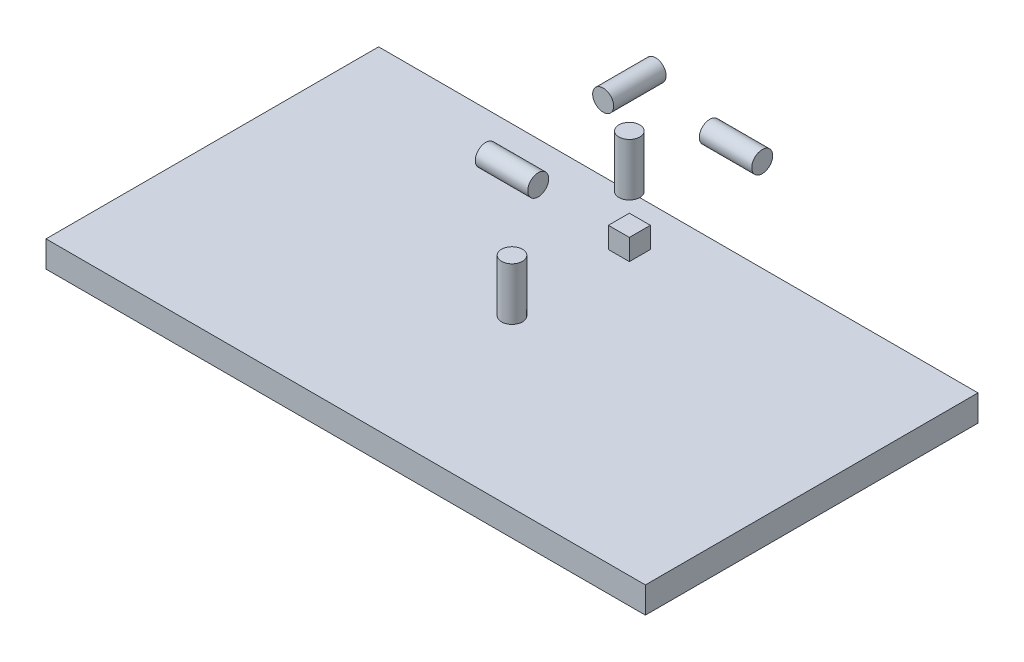
ISO-10303-21;
HEADER;
FILE_DESCRIPTION(('STEP AP214'),'2;1');
FILE_NAME('part.step','',(''),(''),'','','');
FILE_SCHEMA(('AUTOMOTIVE_DESIGN { 1 0 10303 214 1 1 1 1 }'));
ENDSEC;
DATA;
#1=APPLICATION_CONTEXT('core data for automotive mechanical design processes');
#2=APPLICATION_PROTOCOL_DEFINITION('international standard','automotive_design',2000,#1);
#3=PRODUCT_CONTEXT('',#1,'mechanical');
#4=PRODUCT('Part','Part','',(#3));
#5=PRODUCT_RELATED_PRODUCT_CATEGORY('part','',(#4));
#6=PRODUCT_DEFINITION_FORMATION('','',#4);
#7=PRODUCT_DEFINITION_CONTEXT('part definition',#1,'design');
#8=PRODUCT_DEFINITION('design','',#6,#7);
#9=PRODUCT_DEFINITION_SHAPE('','',#8);
#10=(LENGTH_UNIT() NAMED_UNIT(*) SI_UNIT(.MILLI.,.METRE.));
#11=(NAMED_UNIT(*) PLANE_ANGLE_UNIT() SI_UNIT($,.RADIAN.));
#12=(NAMED_UNIT(*) SI_UNIT($,.STERADIAN.) SOLID_ANGLE_UNIT());
#13=UNCERTAINTY_MEASURE_WITH_UNIT(LENGTH_MEASURE(1.E-05),#10,'distance_accuracy_value','');
#14=(GEOMETRIC_REPRESENTATION_CONTEXT(3) GLOBAL_UNCERTAINTY_ASSIGNED_CONTEXT((#13)) GLOBAL_UNIT_ASSIGNED_CONTEXT((#10,
#11,#12)) REPRESENTATION_CONTEXT('',''));
#15=CARTESIAN_POINT('',(0.,0.,0.));
#16=DIRECTION('',(0.,0.,1.));
#17=DIRECTION('',(1.,0.,0.));
#18=AXIS2_PLACEMENT_3D('',#15,#16,#17);
#19=CARTESIAN_POINT('',(95.3969810050899,98.6121241485876,0.));
#20=DIRECTION('',(-1.,0.,0.));
#21=DIRECTION('',(0.,0.,1.));
#22=AXIS2_PLACEMENT_3D('',#19,#20,#21);
#23=CYLINDRICAL_SURFACE('',#22,4.);
#24=CARTESIAN_POINT('',(95.3969810050899,98.6121241485876,0.));
#25=DIRECTION('',(1.,0.,0.));
#26=DIRECTION('',(0.,0.,-1.));
#27=AXIS2_PLACEMENT_3D('',#24,#25,#26);
#28=CIRCLE('',#27,4.);
#29=CARTESIAN_POINT('',(95.3969810050899,98.6121241485876,-4.));
#30=VERTEX_POINT('',#29);
#31=EDGE_CURVE('E11',#30,#30,#28,.T.);
#32=ORIENTED_EDGE('',*,*,#31,.F.);
#33=EDGE_LOOP('',(#32));
#34=FACE_BOUND('',#33,.T.);
#35=CARTESIAN_POINT('',(75.3969810050899,98.6121241485876,0.));
#36=DIRECTION('',(1.,0.,0.));
#37=DIRECTION('',(0.,0.,-1.));
#38=AXIS2_PLACEMENT_3D('',#35,#36,#37);
#39=CIRCLE('',#38,4.);
#40=CARTESIAN_POINT('',(75.3969810050899,98.6121241485876,-4.));
#41=VERTEX_POINT('',#40);
#42=EDGE_CURVE('E42',#41,#41,#39,.T.);
#43=ORIENTED_EDGE('',*,*,#42,.T.);
#44=EDGE_LOOP('',(#43));
#45=FACE_BOUND('',#44,.T.);
#46=ADVANCED_FACE('F39',(#34,#45),#23,.T.);
#47=CARTESIAN_POINT('',(95.3969810050899,98.6121241485876,0.));
#48=DIRECTION('',(1.,0.,0.));
#49=DIRECTION('',(0.,0.,-1.));
#50=AXIS2_PLACEMENT_3D('',#47,#48,#49);
#51=PLANE('',#50);
#52=ORIENTED_EDGE('',*,*,#31,.T.);
#53=EDGE_LOOP('',(#52));
#54=FACE_BOUND('',#53,.T.);
#55=ADVANCED_FACE('F54',(#54),#51,.T.);
#56=CARTESIAN_POINT('',(75.3969810050899,98.6121241485876,0.));
#57=DIRECTION('',(1.,0.,0.));
#58=DIRECTION('',(0.,0.,-1.));
#59=AXIS2_PLACEMENT_3D('',#56,#57,#58);
#60=PLANE('',#59);
#61=ORIENTED_EDGE('',*,*,#42,.F.);
#62=EDGE_LOOP('',(#61));
#63=FACE_BOUND('',#62,.T.);
#64=ADVANCED_FACE('F52',(#63),#60,.F.);
#65=CLOSED_SHELL('',(#46,#55,#64));
#66=MANIFOLD_SOLID_BREP('B2',#65);
#67=CARTESIAN_POINT('',(44.7451399134025,98.6121241485876,10.));
#68=DIRECTION('',(0.,0.,-1.));
#69=DIRECTION('',(-1.,0.,0.));
#70=AXIS2_PLACEMENT_3D('',#67,#68,#69);
#71=CYLINDRICAL_SURFACE('',#70,4.00000000000001);
#72=CARTESIAN_POINT('',(44.7451399134025,98.6121241485876,10.));
#73=DIRECTION('',(0.,0.,1.));
#74=DIRECTION('',(1.,0.,0.));
#75=AXIS2_PLACEMENT_3D('',#72,#73,#74);
#76=CIRCLE('',#75,4.00000000000001);
#77=CARTESIAN_POINT('',(48.7451399134025,98.6121241485876,10.));
#78=VERTEX_POINT('',#77);
#79=EDGE_CURVE('E38',#78,#78,#76,.T.);
#80=ORIENTED_EDGE('',*,*,#79,.F.);
#81=EDGE_LOOP('',(#80));
#82=FACE_BOUND('',#81,.T.);
#83=CARTESIAN_POINT('',(44.7451399134025,98.6121241485876,-10.));
#84=DIRECTION('',(0.,0.,1.));
#85=DIRECTION('',(1.,0.,0.));
#86=AXIS2_PLACEMENT_3D('',#83,#84,#85);
#87=CIRCLE('',#86,4.00000000000001);
#88=CARTESIAN_POINT('',(48.7451399134025,98.6121241485876,-10.));
#89=VERTEX_POINT('',#88);
#90=EDGE_CURVE('E90',#89,#89,#87,.T.);
#91=ORIENTED_EDGE('',*,*,#90,.T.);
#92=EDGE_LOOP('',(#91));
#93=FACE_BOUND('',#92,.T.);
#94=ADVANCED_FACE('F87',(#82,#93),#71,.T.);
#95=CARTESIAN_POINT('',(44.7451399134025,98.6121241485876,10.));
#96=DIRECTION('',(0.,0.,1.));
#97=DIRECTION('',(1.,0.,0.));
#98=AXIS2_PLACEMENT_3D('',#95,#96,#97);
#99=PLANE('',#98);
#100=ORIENTED_EDGE('',*,*,#79,.T.);
#101=EDGE_LOOP('',(#100));
#102=FACE_BOUND('',#101,.T.);
#103=ADVANCED_FACE('F102',(#102),#99,.T.);
#104=CARTESIAN_POINT('',(44.7451399134025,98.6121241485876,-10.));
#105=DIRECTION('',(0.,0.,1.));
#106=DIRECTION('',(1.,0.,0.));
#107=AXIS2_PLACEMENT_3D('',#104,#105,#106);
#108=PLANE('',#107);
#109=ORIENTED_EDGE('',*,*,#90,.F.);
#110=EDGE_LOOP('',(#109));
#111=FACE_BOUND('',#110,.T.);
#112=ADVANCED_FACE('F100',(#111),#108,.F.);
#113=CLOSED_SHELL('',(#94,#103,#112));
#114=MANIFOLD_SOLID_BREP('B6',#113);
#115=CARTESIAN_POINT('',(44.7451399134025,83.443144658152,0.));
#116=DIRECTION('',(0.,-1.,0.));
#117=DIRECTION('',(0.,0.,-1.));
#118=AXIS2_PLACEMENT_3D('',#115,#116,#117);
#119=CYLINDRICAL_SURFACE('',#118,4.00000000000001);
#120=CARTESIAN_POINT('',(44.7451399134025,83.443144658152,0.));
#121=DIRECTION('',(0.,1.,0.));
#122=DIRECTION('',(0.,0.,1.));
#123=AXIS2_PLACEMENT_3D('',#120,#121,#122);
#124=CIRCLE('',#123,4.00000000000001);
#125=CARTESIAN_POINT('',(44.7451399134025,83.443144658152,4.00000000000001));
#126=VERTEX_POINT('',#125);
#127=EDGE_CURVE('E86',#126,#126,#124,.T.);
#128=ORIENTED_EDGE('',*,*,#127,.F.);
#129=EDGE_LOOP('',(#128));
#130=FACE_BOUND('',#129,.T.);
#131=CARTESIAN_POINT('',(44.7451399134025,63.4431446581519,0.));
#132=DIRECTION('',(0.,1.,0.));
#133=DIRECTION('',(0.,0.,1.));
#134=AXIS2_PLACEMENT_3D('',#131,#132,#133);
#135=CIRCLE('',#134,4.00000000000001);
#136=CARTESIAN_POINT('',(44.7451399134025,63.4431446581519,4.00000000000001));
#137=VERTEX_POINT('',#136);
#138=EDGE_CURVE('E140',#137,#137,#135,.T.);
#139=ORIENTED_EDGE('',*,*,#138,.T.);
#140=EDGE_LOOP('',(#139));
#141=FACE_BOUND('',#140,.T.);
#142=ADVANCED_FACE('F137',(#130,#141),#119,.T.);
#143=CARTESIAN_POINT('',(44.7451399134025,83.443144658152,0.));
#144=DIRECTION('',(0.,1.,0.));
#145=DIRECTION('',(0.,0.,1.));
#146=AXIS2_PLACEMENT_3D('',#143,#144,#145);
#147=PLANE('',#146);
#148=ORIENTED_EDGE('',*,*,#127,.T.);
#149=EDGE_LOOP('',(#148));
#150=FACE_BOUND('',#149,.T.);
#151=ADVANCED_FACE('F152',(#150),#147,.T.);
#152=CARTESIAN_POINT('',(44.7451399134025,63.4431446581519,0.));
#153=DIRECTION('',(0.,1.,0.));
#154=DIRECTION('',(0.,0.,1.));
#155=AXIS2_PLACEMENT_3D('',#152,#153,#154);
#156=PLANE('',#155);
#157=ORIENTED_EDGE('',*,*,#138,.F.);
#158=EDGE_LOOP('',(#157));
#159=FACE_BOUND('',#158,.T.);
#160=ADVANCED_FACE('F150',(#159),#156,.F.);
#161=CLOSED_SHELL('',(#142,#151,#160));
#162=MANIFOLD_SOLID_BREP('B33',#161);
#163=CARTESIAN_POINT('',(48.7451399134025,44.2741651677163,4.));
#164=DIRECTION('',(0.,0.,-1.));
#165=DIRECTION('',(-1.,0.,0.));
#166=AXIS2_PLACEMENT_3D('',#163,#164,#165);
#167=PLANE('',#166);
#168=DIRECTION('',(0.,-1.,0.));
#169=VECTOR('',#168,1.);
#170=CARTESIAN_POINT('',(40.7451399134025,44.2741651677163,4.));
#171=LINE('',#170,#169);
#172=CARTESIAN_POINT('',(40.7451399134025,52.2741651677163,4.));
#173=VERTEX_POINT('',#172);
#174=CARTESIAN_POINT('',(40.7451399134025,44.2741651677163,4.));
#175=VERTEX_POINT('',#174);
#176=EDGE_CURVE('E248',#173,#175,#171,.T.);
#177=ORIENTED_EDGE('',*,*,#176,.T.);
#178=DIRECTION('',(-1.,0.,0.));
#179=VECTOR('',#178,1.);
#180=CARTESIAN_POINT('',(48.7451399134025,44.2741651677163,4.));
#181=LINE('',#180,#179);
#182=CARTESIAN_POINT('',(48.7451399134025,44.2741651677163,4.));
#183=VERTEX_POINT('',#182);
#184=EDGE_CURVE('E135',#183,#175,#181,.T.);
#185=ORIENTED_EDGE('',*,*,#184,.F.);
#186=DIRECTION('',(0.,-1.,0.));
#187=VECTOR('',#186,1.);
#188=CARTESIAN_POINT('',(48.7451399134025,44.2741651677163,4.));
#189=LINE('',#188,#187);
#190=CARTESIAN_POINT('',(48.7451399134025,52.2741651677163,4.));
#191=VERTEX_POINT('',#190);
#192=EDGE_CURVE('E236',#191,#183,#189,.T.);
#193=ORIENTED_EDGE('',*,*,#192,.F.);
#194=DIRECTION('',(-1.,0.,0.));
#195=VECTOR('',#194,1.);
#196=CARTESIAN_POINT('',(48.7451399134025,52.2741651677163,4.));
#197=LINE('',#196,#195);
#198=EDGE_CURVE('E244',#191,#173,#197,.T.);
#199=ORIENTED_EDGE('',*,*,#198,.T.);
#200=EDGE_LOOP('',(#177,#185,#193,#199));
#201=FACE_BOUND('',#200,.T.);
#202=ADVANCED_FACE('F185',(#201),#167,.F.);
#203=CARTESIAN_POINT('',(48.7451399134025,44.2741651677163,-4.));
#204=DIRECTION('',(0.,1.,0.));
#205=DIRECTION('',(0.,0.,1.));
#206=AXIS2_PLACEMENT_3D('',#203,#204,#205);
#207=PLANE('',#206);
#208=DIRECTION('',(0.,0.,-1.));
#209=VECTOR('',#208,1.);
#210=CARTESIAN_POINT('',(40.7451399134025,44.2741651677163,-4.));
#211=LINE('',#210,#209);
#212=CARTESIAN_POINT('',(40.7451399134025,44.2741651677163,-4.));
#213=VERTEX_POINT('',#212);
#214=EDGE_CURVE('E240',#175,#213,#211,.T.);
#215=ORIENTED_EDGE('',*,*,#214,.T.);
#216=DIRECTION('',(-1.,0.,0.));
#217=VECTOR('',#216,1.);
#218=CARTESIAN_POINT('',(48.7451399134025,44.2741651677163,-4.));
#219=LINE('',#218,#217);
#220=CARTESIAN_POINT('',(48.7451399134025,44.2741651677163,-4.));
#221=VERTEX_POINT('',#220);
#222=EDGE_CURVE('E193',#221,#213,#219,.T.);
#223=ORIENTED_EDGE('',*,*,#222,.F.);
#224=DIRECTION('',(0.,0.,-1.));
#225=VECTOR('',#224,1.);
#226=CARTESIAN_POINT('',(48.7451399134025,44.2741651677163,-4.));
#227=LINE('',#226,#225);
#228=EDGE_CURVE('E231',#183,#221,#227,.T.);
#229=ORIENTED_EDGE('',*,*,#228,.F.);
#230=ORIENTED_EDGE('',*,*,#184,.T.);
#231=EDGE_LOOP('',(#215,#223,#229,#230));
#232=FACE_BOUND('',#231,.T.);
#233=ADVANCED_FACE('F239',(#232),#207,.F.);
#234=CARTESIAN_POINT('',(48.7451399134025,44.2741651677163,-4.));
#235=DIRECTION('',(0.,0.,1.));
#236=DIRECTION('',(1.,0.,0.));
#237=AXIS2_PLACEMENT_3D('',#234,#235,#236);
#238=PLANE('',#237);
#239=DIRECTION('',(0.,1.,0.));
#240=VECTOR('',#239,1.);
#241=CARTESIAN_POINT('',(40.7451399134025,44.2741651677163,-4.));
#242=LINE('',#241,#240);
#243=CARTESIAN_POINT('',(40.7451399134025,52.2741651677163,-4.));
#244=VERTEX_POINT('',#243);
#245=EDGE_CURVE('E218',#213,#244,#242,.T.);
#246=ORIENTED_EDGE('',*,*,#245,.T.);
#247=DIRECTION('',(-1.,0.,0.));
#248=VECTOR('',#247,1.);
#249=CARTESIAN_POINT('',(48.7451399134025,52.2741651677163,-4.));
#250=LINE('',#249,#248);
#251=CARTESIAN_POINT('',(48.7451399134025,52.2741651677163,-4.));
#252=VERTEX_POINT('',#251);
#253=EDGE_CURVE('E241',#252,#244,#250,.T.);
#254=ORIENTED_EDGE('',*,*,#253,.F.);
#255=DIRECTION('',(0.,1.,0.));
#256=VECTOR('',#255,1.);
#257=CARTESIAN_POINT('',(48.7451399134025,44.2741651677163,-4.));
#258=LINE('',#257,#256);
#259=EDGE_CURVE('E234',#221,#252,#258,.T.);
#260=ORIENTED_EDGE('',*,*,#259,.F.);
#261=ORIENTED_EDGE('',*,*,#222,.T.);
#262=EDGE_LOOP('',(#246,#254,#260,#261));
#263=FACE_BOUND('',#262,.T.);
#264=ADVANCED_FACE('F242',(#263),#238,.F.);
#265=CARTESIAN_POINT('',(48.7451399134025,52.2741651677163,-4.));
#266=DIRECTION('',(0.,-1.,0.));
#267=DIRECTION('',(0.,0.,-1.));
#268=AXIS2_PLACEMENT_3D('',#265,#266,#267);
#269=PLANE('',#268);
#270=DIRECTION('',(0.,0.,1.));
#271=VECTOR('',#270,1.);
#272=CARTESIAN_POINT('',(40.7451399134025,52.2741651677163,-4.));
#273=LINE('',#272,#271);
#274=EDGE_CURVE('E224',#244,#173,#273,.T.);
#275=ORIENTED_EDGE('',*,*,#274,.T.);
#276=ORIENTED_EDGE('',*,*,#198,.F.);
#277=DIRECTION('',(0.,0.,1.));
#278=VECTOR('',#277,1.);
#279=CARTESIAN_POINT('',(48.7451399134025,52.2741651677163,-4.));
#280=LINE('',#279,#278);
#281=EDGE_CURVE('E201',#252,#191,#280,.T.);
#282=ORIENTED_EDGE('',*,*,#281,.F.);
#283=ORIENTED_EDGE('',*,*,#253,.T.);
#284=EDGE_LOOP('',(#275,#276,#282,#283));
#285=FACE_BOUND('',#284,.T.);
#286=ADVANCED_FACE('F255',(#285),#269,.F.);
#287=CARTESIAN_POINT('',(48.7451399134025,0.,0.));
#288=DIRECTION('',(1.,0.,0.));
#289=DIRECTION('',(0.,0.,-1.));
#290=AXIS2_PLACEMENT_3D('',#287,#288,#289);
#291=PLANE('',#290);
#292=ORIENTED_EDGE('',*,*,#192,.T.);
#293=ORIENTED_EDGE('',*,*,#228,.T.);
#294=ORIENTED_EDGE('',*,*,#259,.T.);
#295=ORIENTED_EDGE('',*,*,#281,.T.);
#296=EDGE_LOOP('',(#292,#293,#294,#295));
#297=FACE_BOUND('',#296,.T.);
#298=ADVANCED_FACE('F232',(#297),#291,.T.);
#299=CARTESIAN_POINT('',(40.7451399134025,0.,0.));
#300=DIRECTION('',(1.,0.,0.));
#301=DIRECTION('',(0.,0.,-1.));
#302=AXIS2_PLACEMENT_3D('',#299,#300,#301);
#303=PLANE('',#302);
#304=ORIENTED_EDGE('',*,*,#176,.F.);
#305=ORIENTED_EDGE('',*,*,#274,.F.);
#306=ORIENTED_EDGE('',*,*,#245,.F.);
#307=ORIENTED_EDGE('',*,*,#214,.F.);
#308=EDGE_LOOP('',(#304,#305,#306,#307));
#309=FACE_BOUND('',#308,.T.);
#310=ADVANCED_FACE('F258',(#309),#303,.F.);
#311=CLOSED_SHELL('',(#202,#233,#264,#286,#298,#310));
#312=MANIFOLD_SOLID_BREP('B81',#311);
#313=CARTESIAN_POINT('',(10.,48.2741651677163,0.));
#314=DIRECTION('',(-1.,0.,0.));
#315=DIRECTION('',(0.,0.,1.));
#316=AXIS2_PLACEMENT_3D('',#313,#314,#315);
#317=CYLINDRICAL_SURFACE('',#316,4.);
#318=CARTESIAN_POINT('',(10.,48.2741651677163,0.));
#319=DIRECTION('',(1.,0.,0.));
#320=DIRECTION('',(0.,0.,-1.));
#321=AXIS2_PLACEMENT_3D('',#318,#319,#320);
#322=CIRCLE('',#321,4.);
#323=CARTESIAN_POINT('',(10.,48.2741651677163,-4.));
#324=VERTEX_POINT('',#323);
#325=EDGE_CURVE('E184',#324,#324,#322,.T.);
#326=ORIENTED_EDGE('',*,*,#325,.F.);
#327=EDGE_LOOP('',(#326));
#328=FACE_BOUND('',#327,.T.);
#329=CARTESIAN_POINT('',(-10.,48.2741651677163,0.));
#330=DIRECTION('',(1.,0.,0.));
#331=DIRECTION('',(0.,0.,-1.));
#332=AXIS2_PLACEMENT_3D('',#329,#330,#331);
#333=CIRCLE('',#332,4.);
#334=CARTESIAN_POINT('',(-10.,48.2741651677163,-4.));
#335=VERTEX_POINT('',#334);
#336=EDGE_CURVE('E320',#335,#335,#333,.T.);
#337=ORIENTED_EDGE('',*,*,#336,.T.);
#338=EDGE_LOOP('',(#337));
#339=FACE_BOUND('',#338,.T.);
#340=ADVANCED_FACE('F317',(#328,#339),#317,.T.);
#341=CARTESIAN_POINT('',(10.,48.2741651677163,0.));
#342=DIRECTION('',(1.,0.,0.));
#343=DIRECTION('',(0.,0.,-1.));
#344=AXIS2_PLACEMENT_3D('',#341,#342,#343);
#345=PLANE('',#344);
#346=ORIENTED_EDGE('',*,*,#325,.T.);
#347=EDGE_LOOP('',(#346));
#348=FACE_BOUND('',#347,.T.);
#349=ADVANCED_FACE('F332',(#348),#345,.T.);
#350=CARTESIAN_POINT('',(-10.,48.2741651677163,0.));
#351=DIRECTION('',(1.,0.,0.));
#352=DIRECTION('',(0.,0.,-1.));
#353=AXIS2_PLACEMENT_3D('',#350,#351,#352);
#354=PLANE('',#353);
#355=ORIENTED_EDGE('',*,*,#336,.F.);
#356=EDGE_LOOP('',(#355));
#357=FACE_BOUND('',#356,.T.);
#358=ADVANCED_FACE('F330',(#357),#354,.F.);
#359=CLOSED_SHELL('',(#340,#349,#358));
#360=MANIFOLD_SOLID_BREP('B129',#359);
#361=CARTESIAN_POINT('',(-114.255899932367,-10.,63.4021178815449));
#362=DIRECTION('',(-1.,0.,0.));
#363=DIRECTION('',(0.,0.,1.));
#364=AXIS2_PLACEMENT_3D('',#361,#362,#363);
#365=PLANE('',#364);
#366=DIRECTION('',(0.,0.,1.));
#367=VECTOR('',#366,1.);
#368=CARTESIAN_POINT('',(-114.255899932367,0.,63.4021178815449));
#369=LINE('',#368,#367);
#370=CARTESIAN_POINT('',(-114.255899932367,0.,-63.4021178815449));
#371=VERTEX_POINT('',#370);
#372=CARTESIAN_POINT('',(-114.255899932367,0.,63.4021178815449));
#373=VERTEX_POINT('',#372);
#374=EDGE_CURVE('E422',#371,#373,#369,.T.);
#375=ORIENTED_EDGE('',*,*,#374,.F.);
#376=DIRECTION('',(0.,1.,0.));
#377=VECTOR('',#376,1.);
#378=CARTESIAN_POINT('',(-114.255899932367,-10.,-63.4021178815449));
#379=LINE('',#378,#377);
#380=CARTESIAN_POINT('',(-114.255899932367,-10.,-63.4021178815449));
#381=VERTEX_POINT('',#380);
#382=EDGE_CURVE('E315',#381,#371,#379,.T.);
#383=ORIENTED_EDGE('',*,*,#382,.F.);
#384=DIRECTION('',(0.,0.,1.));
#385=VECTOR('',#384,1.);
#386=CARTESIAN_POINT('',(-114.255899932367,-10.,63.4021178815449));
#387=LINE('',#386,#385);
#388=CARTESIAN_POINT('',(-114.255899932367,-10.,63.4021178815449));
#389=VERTEX_POINT('',#388);
#390=EDGE_CURVE('E415',#381,#389,#387,.T.);
#391=ORIENTED_EDGE('',*,*,#390,.T.);
#392=DIRECTION('',(0.,1.,0.));
#393=VECTOR('',#392,1.);
#394=CARTESIAN_POINT('',(-114.255899932367,-10.,63.4021178815449));
#395=LINE('',#394,#393);
#396=EDGE_CURVE('E360',#389,#373,#395,.T.);
#397=ORIENTED_EDGE('',*,*,#396,.T.);
#398=EDGE_LOOP('',(#375,#383,#391,#397));
#399=FACE_BOUND('',#398,.T.);
#400=ADVANCED_FACE('F357',(#399),#365,.T.);
#401=CARTESIAN_POINT('',(114.255899932367,-10.,-63.4021178815449));
#402=DIRECTION('',(0.,0.,-1.));
#403=DIRECTION('',(-1.,0.,0.));
#404=AXIS2_PLACEMENT_3D('',#401,#402,#403);
#405=PLANE('',#404);
#406=DIRECTION('',(-1.,0.,0.));
#407=VECTOR('',#406,1.);
#408=CARTESIAN_POINT('',(114.255899932367,0.,-63.4021178815449));
#409=LINE('',#408,#407);
#410=CARTESIAN_POINT('',(114.255899932367,0.,-63.4021178815449));
#411=VERTEX_POINT('',#410);
#412=EDGE_CURVE('E417',#411,#371,#409,.T.);
#413=ORIENTED_EDGE('',*,*,#412,.F.);
#414=DIRECTION('',(0.,1.,0.));
#415=VECTOR('',#414,1.);
#416=CARTESIAN_POINT('',(114.255899932367,-10.,-63.4021178815449));
#417=LINE('',#416,#415);
#418=CARTESIAN_POINT('',(114.255899932367,-10.,-63.4021178815449));
#419=VERTEX_POINT('',#418);
#420=EDGE_CURVE('E366',#419,#411,#417,.T.);
#421=ORIENTED_EDGE('',*,*,#420,.F.);
#422=DIRECTION('',(-1.,0.,0.));
#423=VECTOR('',#422,1.);
#424=CARTESIAN_POINT('',(114.255899932367,-10.,-63.4021178815449));
#425=LINE('',#424,#423);
#426=EDGE_CURVE('E412',#419,#381,#425,.T.);
#427=ORIENTED_EDGE('',*,*,#426,.T.);
#428=ORIENTED_EDGE('',*,*,#382,.T.);
#429=EDGE_LOOP('',(#413,#421,#427,#428));
#430=FACE_BOUND('',#429,.T.);
#431=ADVANCED_FACE('F433',(#430),#405,.T.);
#432=CARTESIAN_POINT('',(114.255899932367,-10.,63.4021178815449));
#433=DIRECTION('',(1.,0.,0.));
#434=DIRECTION('',(0.,0.,-1.));
#435=AXIS2_PLACEMENT_3D('',#432,#433,#434);
#436=PLANE('',#435);
#437=DIRECTION('',(0.,0.,-1.));
#438=VECTOR('',#437,1.);
#439=CARTESIAN_POINT('',(114.255899932367,0.,63.4021178815449));
#440=LINE('',#439,#438);
#441=CARTESIAN_POINT('',(114.255899932367,0.,63.4021178815449));
#442=VERTEX_POINT('',#441);
#443=EDGE_CURVE('E407',#442,#411,#440,.T.);
#444=ORIENTED_EDGE('',*,*,#443,.F.);
#445=DIRECTION('',(0.,1.,0.));
#446=VECTOR('',#445,1.);
#447=CARTESIAN_POINT('',(114.255899932367,-10.,63.4021178815449));
#448=LINE('',#447,#446);
#449=CARTESIAN_POINT('',(114.255899932367,-10.,63.4021178815449));
#450=VERTEX_POINT('',#449);
#451=EDGE_CURVE('E402',#450,#442,#448,.T.);
#452=ORIENTED_EDGE('',*,*,#451,.F.);
#453=DIRECTION('',(0.,0.,-1.));
#454=VECTOR('',#453,1.);
#455=CARTESIAN_POINT('',(114.255899932367,-10.,63.4021178815449));
#456=LINE('',#455,#454);
#457=EDGE_CURVE('E405',#450,#419,#456,.T.);
#458=ORIENTED_EDGE('',*,*,#457,.T.);
#459=ORIENTED_EDGE('',*,*,#420,.T.);
#460=EDGE_LOOP('',(#444,#452,#458,#459));
#461=FACE_BOUND('',#460,.T.);
#462=ADVANCED_FACE('F404',(#461),#436,.T.);
#463=CARTESIAN_POINT('',(114.255899932367,-10.,63.4021178815449));
#464=DIRECTION('',(0.,0.,1.));
#465=DIRECTION('',(1.,0.,0.));
#466=AXIS2_PLACEMENT_3D('',#463,#464,#465);
#467=PLANE('',#466);
#468=DIRECTION('',(1.,0.,0.));
#469=VECTOR('',#468,1.);
#470=CARTESIAN_POINT('',(114.255899932367,0.,63.4021178815449));
#471=LINE('',#470,#469);
#472=EDGE_CURVE('E425',#373,#442,#471,.T.);
#473=ORIENTED_EDGE('',*,*,#472,.F.);
#474=ORIENTED_EDGE('',*,*,#396,.F.);
#475=DIRECTION('',(1.,0.,0.));
#476=VECTOR('',#475,1.);
#477=CARTESIAN_POINT('',(114.255899932367,-10.,63.4021178815449));
#478=LINE('',#477,#476);
#479=EDGE_CURVE('E411',#389,#450,#478,.T.);
#480=ORIENTED_EDGE('',*,*,#479,.T.);
#481=ORIENTED_EDGE('',*,*,#451,.T.);
#482=EDGE_LOOP('',(#473,#474,#480,#481));
#483=FACE_BOUND('',#482,.T.);
#484=ADVANCED_FACE('F414',(#483),#467,.T.);
#485=CARTESIAN_POINT('',(0.,-10.,0.));
#486=DIRECTION('',(0.,1.,0.));
#487=DIRECTION('',(0.,0.,1.));
#488=AXIS2_PLACEMENT_3D('',#485,#486,#487);
#489=PLANE('',#488);
#490=ORIENTED_EDGE('',*,*,#390,.F.);
#491=ORIENTED_EDGE('',*,*,#426,.F.);
#492=ORIENTED_EDGE('',*,*,#457,.F.);
#493=ORIENTED_EDGE('',*,*,#479,.F.);
#494=EDGE_LOOP('',(#490,#491,#492,#493));
#495=FACE_BOUND('',#494,.T.);
#496=ADVANCED_FACE('F410',(#495),#489,.F.);
#497=CARTESIAN_POINT('',(0.,0.,0.));
#498=DIRECTION('',(0.,1.,0.));
#499=DIRECTION('',(0.,0.,1.));
#500=AXIS2_PLACEMENT_3D('',#497,#498,#499);
#501=PLANE('',#500);
#502=CARTESIAN_POINT('',(0.,0.,0.));
#503=DIRECTION('',(0.,1.,0.));
#504=DIRECTION('',(0.,0.,1.));
#505=AXIS2_PLACEMENT_3D('',#502,#503,#504);
#506=CIRCLE('',#505,4.);
#507=CARTESIAN_POINT('',(0.,0.,4.));
#508=VERTEX_POINT('',#507);
#509=EDGE_CURVE('E463',#508,#508,#506,.T.);
#510=ORIENTED_EDGE('',*,*,#509,.F.);
#511=EDGE_LOOP('',(#510));
#512=FACE_BOUND('',#511,.T.);
#513=ORIENTED_EDGE('',*,*,#374,.T.);
#514=ORIENTED_EDGE('',*,*,#472,.T.);
#515=ORIENTED_EDGE('',*,*,#443,.T.);
#516=ORIENTED_EDGE('',*,*,#412,.T.);
#517=EDGE_LOOP('',(#513,#514,#515,#516));
#518=FACE_BOUND('',#517,.T.);
#519=ADVANCED_FACE('F432',(#512,#518),#501,.T.);
#520=CARTESIAN_POINT('',(0.,20.,0.));
#521=DIRECTION('',(0.,-1.,0.));
#522=DIRECTION('',(0.,0.,-1.));
#523=AXIS2_PLACEMENT_3D('',#520,#521,#522);
#524=CYLINDRICAL_SURFACE('',#523,4.);
#525=CARTESIAN_POINT('',(0.,20.,0.));
#526=DIRECTION('',(0.,1.,0.));
#527=DIRECTION('',(0.,0.,1.));
#528=AXIS2_PLACEMENT_3D('',#525,#526,#527);
#529=CIRCLE('',#528,4.);
#530=CARTESIAN_POINT('',(0.,20.,4.));
#531=VERTEX_POINT('',#530);
#532=EDGE_CURVE('E426',#531,#531,#529,.T.);
#533=ORIENTED_EDGE('',*,*,#532,.F.);
#534=EDGE_LOOP('',(#533));
#535=FACE_BOUND('',#534,.T.);
#536=ORIENTED_EDGE('',*,*,#509,.T.);
#537=EDGE_LOOP('',(#536));
#538=FACE_BOUND('',#537,.T.);
#539=ADVANCED_FACE('F450',(#535,#538),#524,.T.);
#540=CARTESIAN_POINT('',(0.,20.,0.));
#541=DIRECTION('',(0.,1.,0.));
#542=DIRECTION('',(0.,0.,1.));
#543=AXIS2_PLACEMENT_3D('',#540,#541,#542);
#544=PLANE('',#543);
#545=ORIENTED_EDGE('',*,*,#532,.T.);
#546=EDGE_LOOP('',(#545));
#547=FACE_BOUND('',#546,.T.);
#548=ADVANCED_FACE('F455',(#547),#544,.T.);
#549=CLOSED_SHELL('',(#400,#431,#462,#484,#496,#519,#539,#548));
#550=MANIFOLD_SOLID_BREP('B179',#549);
#551=ADVANCED_BREP_SHAPE_REPRESENTATION('',(#18,#66,#114,#162,#312,#360,#550),#14);
#552=SHAPE_DEFINITION_REPRESENTATION(#9,#551);
ENDSEC;
END-ISO-10303-21;
